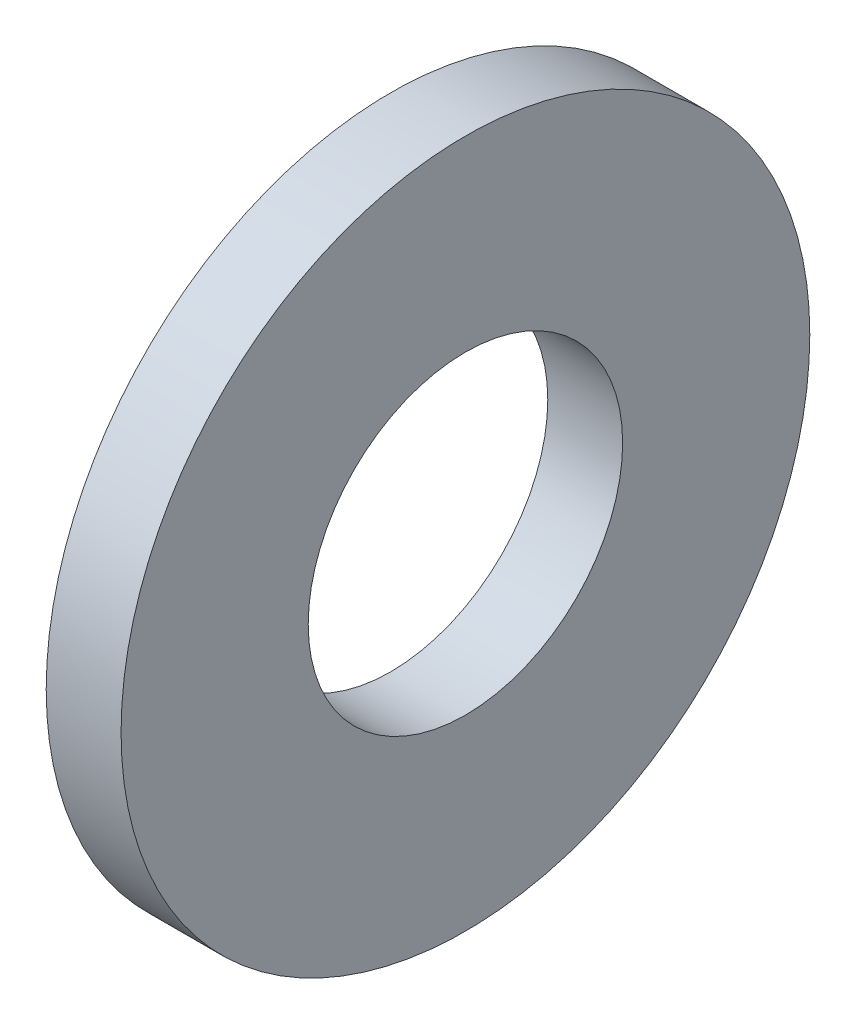
ISO-10303-21;
HEADER;
FILE_DESCRIPTION(('STEP AP214'),'2;1');
FILE_NAME('part.step','',(''),(''),'','','');
FILE_SCHEMA(('AUTOMOTIVE_DESIGN { 1 0 10303 214 1 1 1 1 }'));
ENDSEC;
DATA;
#1=APPLICATION_CONTEXT('core data for automotive mechanical design processes');
#2=APPLICATION_PROTOCOL_DEFINITION('international standard','automotive_design',2000,#1);
#3=PRODUCT_CONTEXT('',#1,'mechanical');
#4=PRODUCT('Part','Part','',(#3));
#5=PRODUCT_RELATED_PRODUCT_CATEGORY('part','',(#4));
#6=PRODUCT_DEFINITION_FORMATION('','',#4);
#7=PRODUCT_DEFINITION_CONTEXT('part definition',#1,'design');
#8=PRODUCT_DEFINITION('design','',#6,#7);
#9=PRODUCT_DEFINITION_SHAPE('','',#8);
#10=(LENGTH_UNIT() NAMED_UNIT(*) SI_UNIT(.MILLI.,.METRE.));
#11=(NAMED_UNIT(*) PLANE_ANGLE_UNIT() SI_UNIT($,.RADIAN.));
#12=(NAMED_UNIT(*) SI_UNIT($,.STERADIAN.) SOLID_ANGLE_UNIT());
#13=UNCERTAINTY_MEASURE_WITH_UNIT(LENGTH_MEASURE(1.E-05),#10,'distance_accuracy_value','');
#14=(GEOMETRIC_REPRESENTATION_CONTEXT(3) GLOBAL_UNCERTAINTY_ASSIGNED_CONTEXT((#13)) GLOBAL_UNIT_ASSIGNED_CONTEXT((#10,
#11,#12)) REPRESENTATION_CONTEXT('',''));
#15=CARTESIAN_POINT('',(0.,0.,0.));
#16=DIRECTION('',(0.,0.,1.));
#17=DIRECTION('',(1.,0.,0.));
#18=AXIS2_PLACEMENT_3D('',#15,#16,#17);
#19=CARTESIAN_POINT('',(2.5,0.,0.));
#20=DIRECTION('',(1.,0.,0.));
#21=DIRECTION('',(0.,0.,-1.));
#22=AXIS2_PLACEMENT_3D('',#19,#20,#21);
#23=PLANE('',#22);
#24=CARTESIAN_POINT('',(2.5,0.,0.));
#25=DIRECTION('',(1.,0.,0.));
#26=DIRECTION('',(0.,0.,-1.));
#27=AXIS2_PLACEMENT_3D('',#24,#25,#26);
#28=CIRCLE('',#27,11.5);
#29=CARTESIAN_POINT('',(2.5,0.,-11.5));
#30=VERTEX_POINT('',#29);
#31=EDGE_CURVE('E10',#30,#30,#28,.T.);
#32=ORIENTED_EDGE('',*,*,#31,.T.);
#33=EDGE_LOOP('',(#32));
#34=FACE_BOUND('',#33,.T.);
#35=CARTESIAN_POINT('',(2.5,0.,0.));
#36=DIRECTION('',(1.,0.,0.));
#37=DIRECTION('',(0.,0.,-1.));
#38=AXIS2_PLACEMENT_3D('',#35,#36,#37);
#39=CIRCLE('',#38,5.25);
#40=CARTESIAN_POINT('',(2.5,0.,-5.25));
#41=VERTEX_POINT('',#40);
#42=EDGE_CURVE('E41',#41,#41,#39,.T.);
#43=ORIENTED_EDGE('',*,*,#42,.F.);
#44=EDGE_LOOP('',(#43));
#45=FACE_BOUND('',#44,.T.);
#46=ADVANCED_FACE('F30',(#34,#45),#23,.T.);
#47=CARTESIAN_POINT('',(0.,0.,0.));
#48=DIRECTION('',(1.,0.,0.));
#49=DIRECTION('',(0.,0.,-1.));
#50=AXIS2_PLACEMENT_3D('',#47,#48,#49);
#51=PLANE('',#50);
#52=CARTESIAN_POINT('',(0.,0.,0.));
#53=DIRECTION('',(1.,0.,0.));
#54=DIRECTION('',(0.,0.,-1.));
#55=AXIS2_PLACEMENT_3D('',#52,#53,#54);
#56=CIRCLE('',#55,11.5);
#57=CARTESIAN_POINT('',(0.,0.,-11.5));
#58=VERTEX_POINT('',#57);
#59=EDGE_CURVE('E34',#58,#58,#56,.T.);
#60=ORIENTED_EDGE('',*,*,#59,.F.);
#61=EDGE_LOOP('',(#60));
#62=FACE_BOUND('',#61,.T.);
#63=CARTESIAN_POINT('',(0.,0.,0.));
#64=DIRECTION('',(1.,0.,0.));
#65=DIRECTION('',(0.,0.,-1.));
#66=AXIS2_PLACEMENT_3D('',#63,#64,#65);
#67=CIRCLE('',#66,5.25);
#68=CARTESIAN_POINT('',(0.,0.,-5.25));
#69=VERTEX_POINT('',#68);
#70=EDGE_CURVE('E43',#69,#69,#67,.T.);
#71=ORIENTED_EDGE('',*,*,#70,.T.);
#72=EDGE_LOOP('',(#71));
#73=FACE_BOUND('',#72,.T.);
#74=ADVANCED_FACE('F53',(#62,#73),#51,.F.);
#75=CARTESIAN_POINT('',(2.5,0.,0.));
#76=DIRECTION('',(-1.,0.,0.));
#77=DIRECTION('',(0.,0.,1.));
#78=AXIS2_PLACEMENT_3D('',#75,#76,#77);
#79=CYLINDRICAL_SURFACE('',#78,11.5);
#80=ORIENTED_EDGE('',*,*,#31,.F.);
#81=EDGE_LOOP('',(#80));
#82=FACE_BOUND('',#81,.T.);
#83=ORIENTED_EDGE('',*,*,#59,.T.);
#84=EDGE_LOOP('',(#83));
#85=FACE_BOUND('',#84,.T.);
#86=ADVANCED_FACE('F32',(#82,#85),#79,.T.);
#87=CARTESIAN_POINT('',(2.5,0.,0.));
#88=DIRECTION('',(-1.,0.,0.));
#89=DIRECTION('',(0.,0.,1.));
#90=AXIS2_PLACEMENT_3D('',#87,#88,#89);
#91=CYLINDRICAL_SURFACE('',#90,5.25);
#92=ORIENTED_EDGE('',*,*,#42,.T.);
#93=EDGE_LOOP('',(#92));
#94=FACE_BOUND('',#93,.T.);
#95=ORIENTED_EDGE('',*,*,#70,.F.);
#96=EDGE_LOOP('',(#95));
#97=FACE_BOUND('',#96,.T.);
#98=ADVANCED_FACE('F49',(#94,#97),#91,.F.);
#99=CLOSED_SHELL('',(#46,#74,#86,#98));
#100=MANIFOLD_SOLID_BREP('B2',#99);
#101=ADVANCED_BREP_SHAPE_REPRESENTATION('',(#18,#100),#14);
#102=SHAPE_DEFINITION_REPRESENTATION(#9,#101);
ENDSEC;
END-ISO-10303-21;
